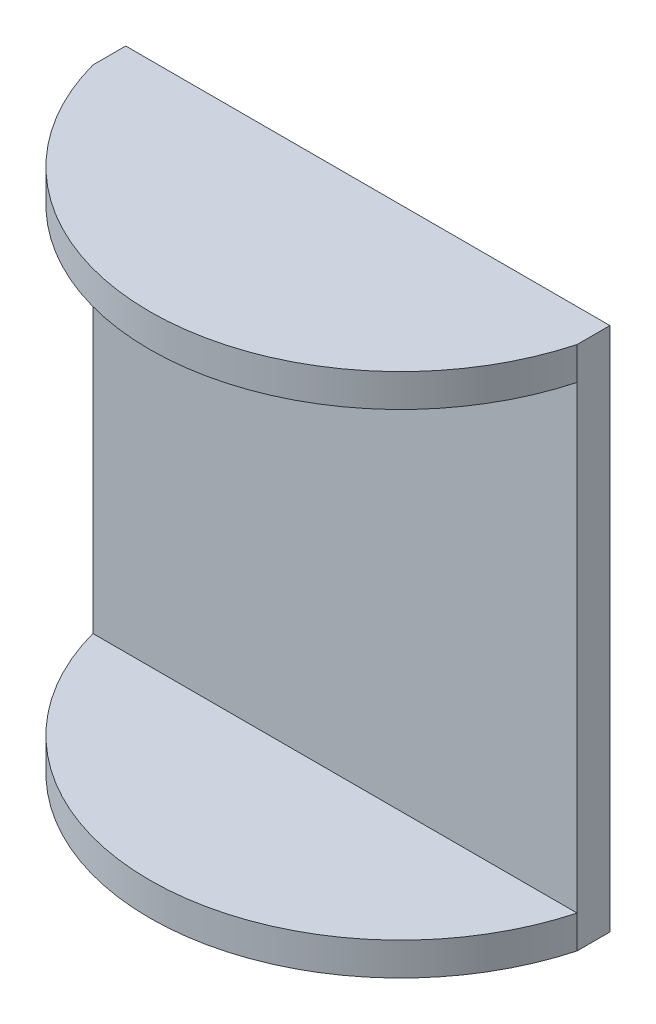
ISO-10303-21;
HEADER;
FILE_DESCRIPTION(('STEP AP214'),'2;1');
FILE_NAME('part.step','',(''),(''),'','','');
FILE_SCHEMA(('AUTOMOTIVE_DESIGN { 1 0 10303 214 1 1 1 1 }'));
ENDSEC;
DATA;
#1=APPLICATION_CONTEXT('core data for automotive mechanical design processes');
#2=APPLICATION_PROTOCOL_DEFINITION('international standard','automotive_design',2000,#1);
#3=PRODUCT_CONTEXT('',#1,'mechanical');
#4=PRODUCT('Part','Part','',(#3));
#5=PRODUCT_RELATED_PRODUCT_CATEGORY('part','',(#4));
#6=PRODUCT_DEFINITION_FORMATION('','',#4);
#7=PRODUCT_DEFINITION_CONTEXT('part definition',#1,'design');
#8=PRODUCT_DEFINITION('design','',#6,#7);
#9=PRODUCT_DEFINITION_SHAPE('','',#8);
#10=(LENGTH_UNIT() NAMED_UNIT(*) SI_UNIT(.MILLI.,.METRE.));
#11=(NAMED_UNIT(*) PLANE_ANGLE_UNIT() SI_UNIT($,.RADIAN.));
#12=(NAMED_UNIT(*) SI_UNIT($,.STERADIAN.) SOLID_ANGLE_UNIT());
#13=UNCERTAINTY_MEASURE_WITH_UNIT(LENGTH_MEASURE(1.E-05),#10,'distance_accuracy_value','');
#14=(GEOMETRIC_REPRESENTATION_CONTEXT(3) GLOBAL_UNCERTAINTY_ASSIGNED_CONTEXT((#13)) GLOBAL_UNIT_ASSIGNED_CONTEXT((#10,
#11,#12)) REPRESENTATION_CONTEXT('',''));
#15=CARTESIAN_POINT('',(0.,0.,0.));
#16=DIRECTION('',(0.,0.,1.));
#17=DIRECTION('',(1.,0.,0.));
#18=AXIS2_PLACEMENT_3D('',#15,#16,#17);
#19=CARTESIAN_POINT('',(-37.465,81.28,0.));
#20=DIRECTION('',(0.,0.,-1.));
#21=DIRECTION('',(-1.,0.,0.));
#22=AXIS2_PLACEMENT_3D('',#19,#20,#21);
#23=PLANE('',#22);
#24=DIRECTION('',(-1.,0.,0.));
#25=VECTOR('',#24,1.);
#26=CARTESIAN_POINT('',(-37.465,76.2,0.));
#27=LINE('',#26,#25);
#28=CARTESIAN_POINT('',(37.465,76.2,0.));
#29=VERTEX_POINT('',#28);
#30=CARTESIAN_POINT('',(-37.465,76.2,0.));
#31=VERTEX_POINT('',#30);
#32=EDGE_CURVE('E96',#29,#31,#27,.T.);
#33=ORIENTED_EDGE('',*,*,#32,.T.);
#34=DIRECTION('',(0.,-1.,0.));
#35=VECTOR('',#34,1.);
#36=CARTESIAN_POINT('',(-37.465,81.28,0.));
#37=LINE('',#36,#35);
#38=CARTESIAN_POINT('',(-37.465,5.08,0.));
#39=VERTEX_POINT('',#38);
#40=EDGE_CURVE('E53',#31,#39,#37,.T.);
#41=ORIENTED_EDGE('',*,*,#40,.T.);
#42=DIRECTION('',(-1.,0.,0.));
#43=VECTOR('',#42,1.);
#44=CARTESIAN_POINT('',(-37.465,5.08,0.));
#45=LINE('',#44,#43);
#46=CARTESIAN_POINT('',(37.465,5.08,0.));
#47=VERTEX_POINT('',#46);
#48=EDGE_CURVE('E104',#47,#39,#45,.T.);
#49=ORIENTED_EDGE('',*,*,#48,.F.);
#50=DIRECTION('',(0.,-1.,0.));
#51=VECTOR('',#50,1.);
#52=CARTESIAN_POINT('',(37.465,81.28,0.));
#53=LINE('',#52,#51);
#54=EDGE_CURVE('E103',#29,#47,#53,.T.);
#55=ORIENTED_EDGE('',*,*,#54,.F.);
#56=EDGE_LOOP('',(#33,#41,#49,#55));
#57=FACE_BOUND('',#56,.T.);
#58=ADVANCED_FACE('F37',(#57),#23,.F.);
#59=CARTESIAN_POINT('',(0.,5.08,-10.16));
#60=DIRECTION('',(0.,-1.,0.));
#61=DIRECTION('',(0.,0.,-1.));
#62=AXIS2_PLACEMENT_3D('',#59,#60,#61);
#63=CYLINDRICAL_SURFACE('',#62,38.8181893575679);
#64=CARTESIAN_POINT('',(0.,0.,-10.16));
#65=DIRECTION('',(0.,1.,0.));
#66=DIRECTION('',(0.,0.,1.));
#67=AXIS2_PLACEMENT_3D('',#64,#65,#66);
#68=CIRCLE('',#67,38.8181893575679);
#69=CARTESIAN_POINT('',(-37.465,0.,0.));
#70=VERTEX_POINT('',#69);
#71=CARTESIAN_POINT('',(37.465,0.,0.));
#72=VERTEX_POINT('',#71);
#73=EDGE_CURVE('E112',#70,#72,#68,.T.);
#74=ORIENTED_EDGE('',*,*,#73,.T.);
#75=DIRECTION('',(0.,-1.,0.));
#76=VECTOR('',#75,1.);
#77=CARTESIAN_POINT('',(37.465,5.08,0.));
#78=LINE('',#77,#76);
#79=EDGE_CURVE('E11',#47,#72,#78,.T.);
#80=ORIENTED_EDGE('',*,*,#79,.F.);
#81=CARTESIAN_POINT('',(0.,5.08,-10.16));
#82=DIRECTION('',(0.,1.,0.));
#83=DIRECTION('',(0.,0.,1.));
#84=AXIS2_PLACEMENT_3D('',#81,#82,#83);
#85=CIRCLE('',#84,38.8181893575679);
#86=EDGE_CURVE('E114',#39,#47,#85,.T.);
#87=ORIENTED_EDGE('',*,*,#86,.F.);
#88=DIRECTION('',(0.,-1.,0.));
#89=VECTOR('',#88,1.);
#90=CARTESIAN_POINT('',(-37.465,5.08,0.));
#91=LINE('',#90,#89);
#92=EDGE_CURVE('E46',#39,#70,#91,.T.);
#93=ORIENTED_EDGE('',*,*,#92,.T.);
#94=EDGE_LOOP('',(#74,#80,#87,#93));
#95=FACE_BOUND('',#94,.T.);
#96=ADVANCED_FACE('F39',(#95),#63,.T.);
#97=CARTESIAN_POINT('',(0.,5.08,-10.16));
#98=DIRECTION('',(0.,1.,0.));
#99=DIRECTION('',(0.,0.,1.));
#100=AXIS2_PLACEMENT_3D('',#97,#98,#99);
#101=PLANE('',#100);
#102=ORIENTED_EDGE('',*,*,#86,.T.);
#103=ORIENTED_EDGE('',*,*,#48,.T.);
#104=EDGE_LOOP('',(#102,#103));
#105=FACE_BOUND('',#104,.T.);
#106=ADVANCED_FACE('F169',(#105),#101,.T.);
#107=CARTESIAN_POINT('',(0.,0.,-10.16));
#108=DIRECTION('',(0.,1.,0.));
#109=DIRECTION('',(0.,0.,1.));
#110=AXIS2_PLACEMENT_3D('',#107,#108,#109);
#111=PLANE('',#110);
#112=ORIENTED_EDGE('',*,*,#73,.F.);
#113=DIRECTION('',(0.,0.,1.));
#114=VECTOR('',#113,1.);
#115=CARTESIAN_POINT('',(-37.465,0.,0.));
#116=LINE('',#115,#114);
#117=CARTESIAN_POINT('',(-37.465,0.,-5.08));
#118=VERTEX_POINT('',#117);
#119=EDGE_CURVE('E128',#118,#70,#116,.T.);
#120=ORIENTED_EDGE('',*,*,#119,.F.);
#121=DIRECTION('',(-1.,0.,0.));
#122=VECTOR('',#121,1.);
#123=CARTESIAN_POINT('',(-37.465,0.,-5.08));
#124=LINE('',#123,#122);
#125=CARTESIAN_POINT('',(37.465,0.,-5.08));
#126=VERTEX_POINT('',#125);
#127=EDGE_CURVE('E136',#126,#118,#124,.T.);
#128=ORIENTED_EDGE('',*,*,#127,.F.);
#129=DIRECTION('',(0.,0.,-1.));
#130=VECTOR('',#129,1.);
#131=CARTESIAN_POINT('',(37.465,0.,0.));
#132=LINE('',#131,#130);
#133=EDGE_CURVE('E101',#72,#126,#132,.T.);
#134=ORIENTED_EDGE('',*,*,#133,.F.);
#135=EDGE_LOOP('',(#112,#120,#128,#134));
#136=FACE_BOUND('',#135,.T.);
#137=ADVANCED_FACE('F152',(#136),#111,.F.);
#138=CARTESIAN_POINT('',(37.465,81.28,0.));
#139=DIRECTION('',(-1.,0.,0.));
#140=DIRECTION('',(0.,0.,1.));
#141=AXIS2_PLACEMENT_3D('',#138,#139,#140);
#142=PLANE('',#141);
#143=CARTESIAN_POINT('',(37.465,81.28,0.));
#144=VERTEX_POINT('',#143);
#145=EDGE_CURVE('E91',#144,#29,#53,.T.);
#146=ORIENTED_EDGE('',*,*,#145,.T.);
#147=ORIENTED_EDGE('',*,*,#54,.T.);
#148=ORIENTED_EDGE('',*,*,#79,.T.);
#149=ORIENTED_EDGE('',*,*,#133,.T.);
#150=DIRECTION('',(0.,-1.,0.));
#151=VECTOR('',#150,1.);
#152=CARTESIAN_POINT('',(37.465,81.28,-5.08));
#153=LINE('',#152,#151);
#154=CARTESIAN_POINT('',(37.465,81.28,-5.08));
#155=VERTEX_POINT('',#154);
#156=EDGE_CURVE('E107',#155,#126,#153,.T.);
#157=ORIENTED_EDGE('',*,*,#156,.F.);
#158=DIRECTION('',(0.,0.,-1.));
#159=VECTOR('',#158,1.);
#160=CARTESIAN_POINT('',(37.465,81.28,0.));
#161=LINE('',#160,#159);
#162=EDGE_CURVE('E111',#144,#155,#161,.T.);
#163=ORIENTED_EDGE('',*,*,#162,.F.);
#164=EDGE_LOOP('',(#146,#147,#148,#149,#157,#163));
#165=FACE_BOUND('',#164,.T.);
#166=ADVANCED_FACE('F109',(#165),#142,.F.);
#167=CARTESIAN_POINT('',(-37.465,81.28,-5.08));
#168=DIRECTION('',(0.,0.,1.));
#169=DIRECTION('',(1.,0.,0.));
#170=AXIS2_PLACEMENT_3D('',#167,#168,#169);
#171=PLANE('',#170);
#172=ORIENTED_EDGE('',*,*,#156,.T.);
#173=ORIENTED_EDGE('',*,*,#127,.T.);
#174=DIRECTION('',(0.,-1.,0.));
#175=VECTOR('',#174,1.);
#176=CARTESIAN_POINT('',(-37.465,81.28,-5.08));
#177=LINE('',#176,#175);
#178=CARTESIAN_POINT('',(-37.465,81.28,-5.08));
#179=VERTEX_POINT('',#178);
#180=EDGE_CURVE('E132',#179,#118,#177,.T.);
#181=ORIENTED_EDGE('',*,*,#180,.F.);
#182=DIRECTION('',(-1.,0.,0.));
#183=VECTOR('',#182,1.);
#184=CARTESIAN_POINT('',(-37.465,81.28,-5.08));
#185=LINE('',#184,#183);
#186=EDGE_CURVE('E138',#155,#179,#185,.T.);
#187=ORIENTED_EDGE('',*,*,#186,.F.);
#188=EDGE_LOOP('',(#172,#173,#181,#187));
#189=FACE_BOUND('',#188,.T.);
#190=ADVANCED_FACE('F149',(#189),#171,.F.);
#191=CARTESIAN_POINT('',(-37.465,81.28,0.));
#192=DIRECTION('',(1.,0.,0.));
#193=DIRECTION('',(0.,0.,-1.));
#194=AXIS2_PLACEMENT_3D('',#191,#192,#193);
#195=PLANE('',#194);
#196=ORIENTED_EDGE('',*,*,#180,.T.);
#197=ORIENTED_EDGE('',*,*,#119,.T.);
#198=ORIENTED_EDGE('',*,*,#92,.F.);
#199=ORIENTED_EDGE('',*,*,#40,.F.);
#200=CARTESIAN_POINT('',(-37.465,81.28,0.));
#201=VERTEX_POINT('',#200);
#202=EDGE_CURVE('E94',#201,#31,#37,.T.);
#203=ORIENTED_EDGE('',*,*,#202,.F.);
#204=DIRECTION('',(0.,0.,1.));
#205=VECTOR('',#204,1.);
#206=CARTESIAN_POINT('',(-37.465,81.28,0.));
#207=LINE('',#206,#205);
#208=EDGE_CURVE('E144',#179,#201,#207,.T.);
#209=ORIENTED_EDGE('',*,*,#208,.F.);
#210=EDGE_LOOP('',(#196,#197,#198,#199,#203,#209));
#211=FACE_BOUND('',#210,.T.);
#212=ADVANCED_FACE('F129',(#211),#195,.F.);
#213=CARTESIAN_POINT('',(0.,81.28,0.));
#214=DIRECTION('',(0.,1.,0.));
#215=DIRECTION('',(0.,0.,1.));
#216=AXIS2_PLACEMENT_3D('',#213,#214,#215);
#217=PLANE('',#216);
#218=ORIENTED_EDGE('',*,*,#208,.T.);
#219=CARTESIAN_POINT('',(0.,81.28,-10.16));
#220=DIRECTION('',(0.,1.,0.));
#221=DIRECTION('',(0.,0.,1.));
#222=AXIS2_PLACEMENT_3D('',#219,#220,#221);
#223=CIRCLE('',#222,38.8181893575679);
#224=EDGE_CURVE('E97',#201,#144,#223,.T.);
#225=ORIENTED_EDGE('',*,*,#224,.T.);
#226=ORIENTED_EDGE('',*,*,#162,.T.);
#227=ORIENTED_EDGE('',*,*,#186,.T.);
#228=EDGE_LOOP('',(#218,#225,#226,#227));
#229=FACE_BOUND('',#228,.T.);
#230=ADVANCED_FACE('F155',(#229),#217,.T.);
#231=CARTESIAN_POINT('',(0.,76.2,-10.16));
#232=DIRECTION('',(0.,1.,0.));
#233=DIRECTION('',(0.,0.,1.));
#234=AXIS2_PLACEMENT_3D('',#231,#232,#233);
#235=CYLINDRICAL_SURFACE('',#234,38.8181893575679);
#236=ORIENTED_EDGE('',*,*,#224,.F.);
#237=ORIENTED_EDGE('',*,*,#202,.T.);
#238=CARTESIAN_POINT('',(0.,76.2,-10.16));
#239=DIRECTION('',(0.,1.,0.));
#240=DIRECTION('',(0.,0.,1.));
#241=AXIS2_PLACEMENT_3D('',#238,#239,#240);
#242=CIRCLE('',#241,38.8181893575679);
#243=EDGE_CURVE('E87',#31,#29,#242,.T.);
#244=ORIENTED_EDGE('',*,*,#243,.T.);
#245=ORIENTED_EDGE('',*,*,#145,.F.);
#246=EDGE_LOOP('',(#236,#237,#244,#245));
#247=FACE_BOUND('',#246,.T.);
#248=ADVANCED_FACE('F89',(#247),#235,.T.);
#249=CARTESIAN_POINT('',(0.,76.2,-10.16));
#250=DIRECTION('',(0.,1.,0.));
#251=DIRECTION('',(0.,0.,1.));
#252=AXIS2_PLACEMENT_3D('',#249,#250,#251);
#253=PLANE('',#252);
#254=ORIENTED_EDGE('',*,*,#243,.F.);
#255=ORIENTED_EDGE('',*,*,#32,.F.);
#256=EDGE_LOOP('',(#254,#255));
#257=FACE_BOUND('',#256,.T.);
#258=ADVANCED_FACE('F100',(#257),#253,.F.);
#259=CLOSED_SHELL('',(#58,#96,#106,#137,#166,#190,#212,#230,#248,#258));
#260=MANIFOLD_SOLID_BREP('B2',#259);
#261=ADVANCED_BREP_SHAPE_REPRESENTATION('',(#18,#260),#14);
#262=SHAPE_DEFINITION_REPRESENTATION(#9,#261);
ENDSEC;
END-ISO-10303-21;
